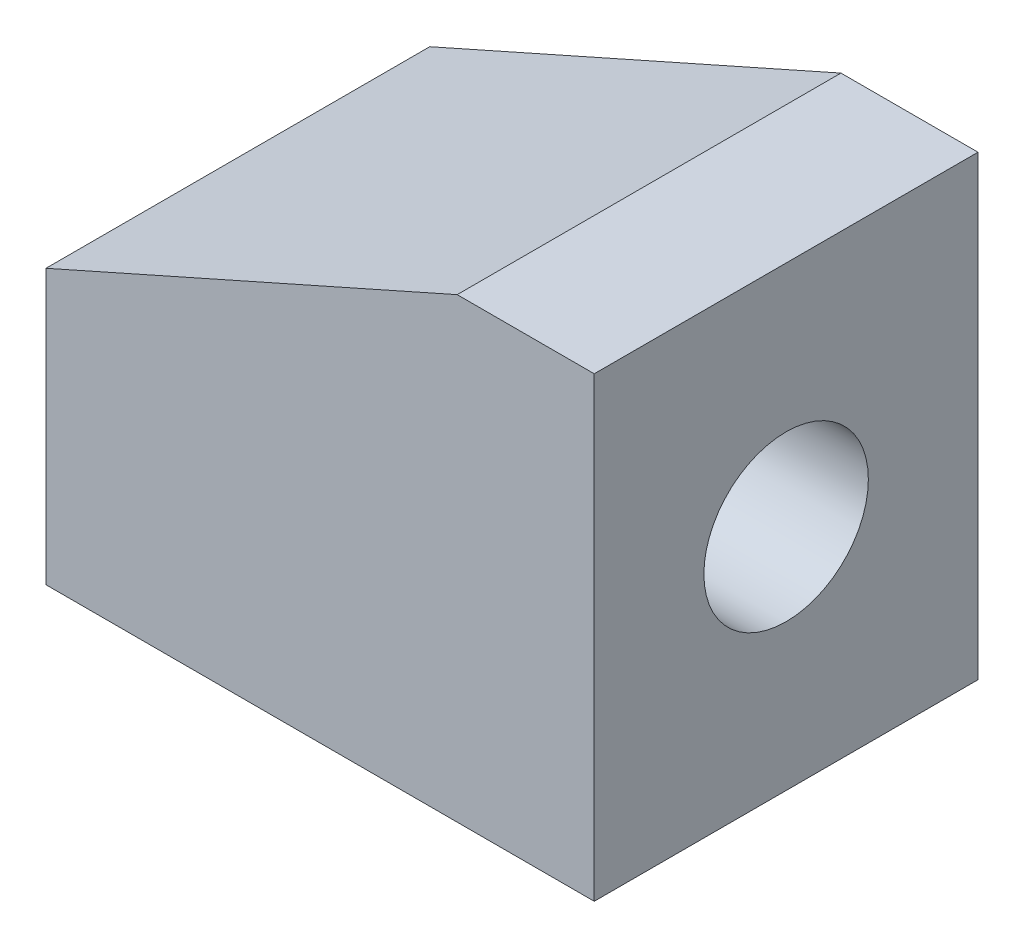
ISO-10303-21;
HEADER;
FILE_DESCRIPTION(('STEP AP214'),'2;1');
FILE_NAME('part.step','',(''),(''),'','','');
FILE_SCHEMA(('AUTOMOTIVE_DESIGN { 1 0 10303 214 1 1 1 1 }'));
ENDSEC;
DATA;
#1=APPLICATION_CONTEXT('core data for automotive mechanical design processes');
#2=APPLICATION_PROTOCOL_DEFINITION('international standard','automotive_design',2000,#1);
#3=PRODUCT_CONTEXT('',#1,'mechanical');
#4=PRODUCT('Part','Part','',(#3));
#5=PRODUCT_RELATED_PRODUCT_CATEGORY('part','',(#4));
#6=PRODUCT_DEFINITION_FORMATION('','',#4);
#7=PRODUCT_DEFINITION_CONTEXT('part definition',#1,'design');
#8=PRODUCT_DEFINITION('design','',#6,#7);
#9=PRODUCT_DEFINITION_SHAPE('','',#8);
#10=(LENGTH_UNIT() NAMED_UNIT(*) SI_UNIT(.MILLI.,.METRE.));
#11=(NAMED_UNIT(*) PLANE_ANGLE_UNIT() SI_UNIT($,.RADIAN.));
#12=(NAMED_UNIT(*) SI_UNIT($,.STERADIAN.) SOLID_ANGLE_UNIT());
#13=UNCERTAINTY_MEASURE_WITH_UNIT(LENGTH_MEASURE(1.E-05),#10,'distance_accuracy_value','');
#14=(GEOMETRIC_REPRESENTATION_CONTEXT(3) GLOBAL_UNCERTAINTY_ASSIGNED_CONTEXT((#13)) GLOBAL_UNIT_ASSIGNED_CONTEXT((#10,
#11,#12)) REPRESENTATION_CONTEXT('',''));
#15=CARTESIAN_POINT('',(0.,0.,0.));
#16=DIRECTION('',(0.,0.,1.));
#17=DIRECTION('',(1.,0.,0.));
#18=AXIS2_PLACEMENT_3D('',#15,#16,#17);
#19=CARTESIAN_POINT('',(0.,50.,21.));
#20=DIRECTION('',(-1.,0.,0.));
#21=DIRECTION('',(0.,-1.,0.));
#22=AXIS2_PLACEMENT_3D('',#19,#20,#21);
#23=PLANE('',#22);
#24=CARTESIAN_POINT('',(0.,25.,0.));
#25=DIRECTION('',(-1.,0.,0.));
#26=DIRECTION('',(0.,-1.,0.));
#27=AXIS2_PLACEMENT_3D('',#24,#25,#26);
#28=CIRCLE('',#27,9.);
#29=CARTESIAN_POINT('',(0.,16.,0.));
#30=VERTEX_POINT('',#29);
#31=EDGE_CURVE('E38',#30,#30,#28,.T.);
#32=ORIENTED_EDGE('',*,*,#31,.T.);
#33=EDGE_LOOP('',(#32));
#34=FACE_BOUND('',#33,.T.);
#35=DIRECTION('',(0.,1.,0.));
#36=VECTOR('',#35,1.);
#37=CARTESIAN_POINT('',(0.,50.,-21.));
#38=LINE('',#37,#36);
#39=CARTESIAN_POINT('',(0.,0.,-21.));
#40=VERTEX_POINT('',#39);
#41=CARTESIAN_POINT('',(0.,50.,-21.));
#42=VERTEX_POINT('',#41);
#43=EDGE_CURVE('E110',#40,#42,#38,.T.);
#44=ORIENTED_EDGE('',*,*,#43,.T.);
#45=DIRECTION('',(0.,0.,-1.));
#46=VECTOR('',#45,1.);
#47=CARTESIAN_POINT('',(0.,50.,21.));
#48=LINE('',#47,#46);
#49=CARTESIAN_POINT('',(0.,50.,21.));
#50=VERTEX_POINT('',#49);
#51=EDGE_CURVE('E11',#50,#42,#48,.T.);
#52=ORIENTED_EDGE('',*,*,#51,.F.);
#53=DIRECTION('',(0.,1.,0.));
#54=VECTOR('',#53,1.);
#55=CARTESIAN_POINT('',(0.,50.,21.));
#56=LINE('',#55,#54);
#57=CARTESIAN_POINT('',(0.,0.,21.));
#58=VERTEX_POINT('',#57);
#59=EDGE_CURVE('E118',#58,#50,#56,.T.);
#60=ORIENTED_EDGE('',*,*,#59,.F.);
#61=DIRECTION('',(0.,0.,-1.));
#62=VECTOR('',#61,1.);
#63=CARTESIAN_POINT('',(0.,0.,21.));
#64=LINE('',#63,#62);
#65=EDGE_CURVE('E106',#58,#40,#64,.T.);
#66=ORIENTED_EDGE('',*,*,#65,.T.);
#67=EDGE_LOOP('',(#44,#52,#60,#66));
#68=FACE_BOUND('',#67,.T.);
#69=ADVANCED_FACE('F35',(#34,#68),#23,.F.);
#70=CARTESIAN_POINT('',(-15.,50.,21.));
#71=DIRECTION('',(0.,-1.,0.));
#72=DIRECTION('',(0.,0.,-1.));
#73=AXIS2_PLACEMENT_3D('',#70,#71,#72);
#74=PLANE('',#73);
#75=DIRECTION('',(-1.,0.,0.));
#76=VECTOR('',#75,1.);
#77=CARTESIAN_POINT('',(-15.,50.,-21.));
#78=LINE('',#77,#76);
#79=CARTESIAN_POINT('',(-15.,50.,-21.));
#80=VERTEX_POINT('',#79);
#81=EDGE_CURVE('E113',#42,#80,#78,.T.);
#82=ORIENTED_EDGE('',*,*,#81,.T.);
#83=DIRECTION('',(0.,0.,-1.));
#84=VECTOR('',#83,1.);
#85=CARTESIAN_POINT('',(-15.,50.,21.));
#86=LINE('',#85,#84);
#87=CARTESIAN_POINT('',(-15.,50.,21.));
#88=VERTEX_POINT('',#87);
#89=EDGE_CURVE('E44',#88,#80,#86,.T.);
#90=ORIENTED_EDGE('',*,*,#89,.F.);
#91=DIRECTION('',(-1.,0.,0.));
#92=VECTOR('',#91,1.);
#93=CARTESIAN_POINT('',(-15.,50.,21.));
#94=LINE('',#93,#92);
#95=EDGE_CURVE('E86',#50,#88,#94,.T.);
#96=ORIENTED_EDGE('',*,*,#95,.F.);
#97=ORIENTED_EDGE('',*,*,#51,.T.);
#98=EDGE_LOOP('',(#82,#90,#96,#97));
#99=FACE_BOUND('',#98,.T.);
#100=ADVANCED_FACE('F138',(#99),#74,.F.);
#101=CARTESIAN_POINT('',(-60.,30.,21.));
#102=DIRECTION('',(0.406138466053448,-0.913811548620257,0.));
#103=DIRECTION('',(0.913811548620257,0.406138466053448,0.));
#104=AXIS2_PLACEMENT_3D('',#101,#102,#103);
#105=PLANE('',#104);
#106=DIRECTION('',(-0.913811548620257,-0.406138466053448,0.));
#107=VECTOR('',#106,1.);
#108=CARTESIAN_POINT('',(-60.,30.,-21.));
#109=LINE('',#108,#107);
#110=CARTESIAN_POINT('',(-60.,30.,-21.));
#111=VERTEX_POINT('',#110);
#112=EDGE_CURVE('E101',#80,#111,#109,.T.);
#113=ORIENTED_EDGE('',*,*,#112,.T.);
#114=DIRECTION('',(0.,0.,-1.));
#115=VECTOR('',#114,1.);
#116=CARTESIAN_POINT('',(-60.,30.,21.));
#117=LINE('',#116,#115);
#118=CARTESIAN_POINT('',(-60.,30.,21.));
#119=VERTEX_POINT('',#118);
#120=EDGE_CURVE('E98',#119,#111,#117,.T.);
#121=ORIENTED_EDGE('',*,*,#120,.F.);
#122=DIRECTION('',(-0.913811548620257,-0.406138466053448,0.));
#123=VECTOR('',#122,1.);
#124=CARTESIAN_POINT('',(-60.,30.,21.));
#125=LINE('',#124,#123);
#126=EDGE_CURVE('E90',#88,#119,#125,.T.);
#127=ORIENTED_EDGE('',*,*,#126,.F.);
#128=ORIENTED_EDGE('',*,*,#89,.T.);
#129=EDGE_LOOP('',(#113,#121,#127,#128));
#130=FACE_BOUND('',#129,.T.);
#131=ADVANCED_FACE('F99',(#130),#105,.F.);
#132=CARTESIAN_POINT('',(-60.,0.,21.));
#133=DIRECTION('',(1.,0.,0.));
#134=DIRECTION('',(0.,0.,-1.));
#135=AXIS2_PLACEMENT_3D('',#132,#133,#134);
#136=PLANE('',#135);
#137=DIRECTION('',(0.,-1.,0.));
#138=VECTOR('',#137,1.);
#139=CARTESIAN_POINT('',(-60.,0.,-21.));
#140=LINE('',#139,#138);
#141=CARTESIAN_POINT('',(-60.,0.,-21.));
#142=VERTEX_POINT('',#141);
#143=EDGE_CURVE('E72',#111,#142,#140,.T.);
#144=ORIENTED_EDGE('',*,*,#143,.T.);
#145=DIRECTION('',(0.,0.,-1.));
#146=VECTOR('',#145,1.);
#147=CARTESIAN_POINT('',(-60.,0.,21.));
#148=LINE('',#147,#146);
#149=CARTESIAN_POINT('',(-60.,0.,21.));
#150=VERTEX_POINT('',#149);
#151=EDGE_CURVE('E102',#150,#142,#148,.T.);
#152=ORIENTED_EDGE('',*,*,#151,.F.);
#153=DIRECTION('',(0.,-1.,0.));
#154=VECTOR('',#153,1.);
#155=CARTESIAN_POINT('',(-60.,0.,21.));
#156=LINE('',#155,#154);
#157=EDGE_CURVE('E94',#119,#150,#156,.T.);
#158=ORIENTED_EDGE('',*,*,#157,.F.);
#159=ORIENTED_EDGE('',*,*,#120,.T.);
#160=EDGE_LOOP('',(#144,#152,#158,#159));
#161=FACE_BOUND('',#160,.T.);
#162=ADVANCED_FACE('F104',(#161),#136,.F.);
#163=CARTESIAN_POINT('',(0.,0.,21.));
#164=DIRECTION('',(0.,1.,0.));
#165=DIRECTION('',(0.,0.,1.));
#166=AXIS2_PLACEMENT_3D('',#163,#164,#165);
#167=PLANE('',#166);
#168=DIRECTION('',(1.,0.,0.));
#169=VECTOR('',#168,1.);
#170=CARTESIAN_POINT('',(0.,0.,-21.));
#171=LINE('',#170,#169);
#172=EDGE_CURVE('E78',#142,#40,#171,.T.);
#173=ORIENTED_EDGE('',*,*,#172,.T.);
#174=ORIENTED_EDGE('',*,*,#65,.F.);
#175=DIRECTION('',(1.,0.,0.));
#176=VECTOR('',#175,1.);
#177=CARTESIAN_POINT('',(0.,0.,21.));
#178=LINE('',#177,#176);
#179=EDGE_CURVE('E52',#150,#58,#178,.T.);
#180=ORIENTED_EDGE('',*,*,#179,.F.);
#181=ORIENTED_EDGE('',*,*,#151,.T.);
#182=EDGE_LOOP('',(#173,#174,#180,#181));
#183=FACE_BOUND('',#182,.T.);
#184=ADVANCED_FACE('F127',(#183),#167,.F.);
#185=CARTESIAN_POINT('',(0.,0.,21.));
#186=DIRECTION('',(0.,0.,-1.));
#187=DIRECTION('',(-1.,0.,0.));
#188=AXIS2_PLACEMENT_3D('',#185,#186,#187);
#189=PLANE('',#188);
#190=ORIENTED_EDGE('',*,*,#59,.T.);
#191=ORIENTED_EDGE('',*,*,#95,.T.);
#192=ORIENTED_EDGE('',*,*,#126,.T.);
#193=ORIENTED_EDGE('',*,*,#157,.T.);
#194=ORIENTED_EDGE('',*,*,#179,.T.);
#195=EDGE_LOOP('',(#190,#191,#192,#193,#194));
#196=FACE_BOUND('',#195,.T.);
#197=ADVANCED_FACE('F92',(#196),#189,.F.);
#198=CARTESIAN_POINT('',(0.,0.,-21.));
#199=DIRECTION('',(0.,0.,-1.));
#200=DIRECTION('',(-1.,0.,0.));
#201=AXIS2_PLACEMENT_3D('',#198,#199,#200);
#202=PLANE('',#201);
#203=ORIENTED_EDGE('',*,*,#43,.F.);
#204=ORIENTED_EDGE('',*,*,#172,.F.);
#205=ORIENTED_EDGE('',*,*,#143,.F.);
#206=ORIENTED_EDGE('',*,*,#112,.F.);
#207=ORIENTED_EDGE('',*,*,#81,.F.);
#208=EDGE_LOOP('',(#203,#204,#205,#206,#207));
#209=FACE_BOUND('',#208,.T.);
#210=ADVANCED_FACE('F123',(#209),#202,.T.);
#211=CARTESIAN_POINT('',(-20.,25.,0.));
#212=DIRECTION('',(1.,0.,0.));
#213=DIRECTION('',(0.,1.,0.));
#214=AXIS2_PLACEMENT_3D('',#211,#212,#213);
#215=CYLINDRICAL_SURFACE('',#214,9.);
#216=CARTESIAN_POINT('',(-20.,25.,0.));
#217=DIRECTION('',(1.,0.,0.));
#218=DIRECTION('',(0.,1.,0.));
#219=AXIS2_PLACEMENT_3D('',#216,#217,#218);
#220=CIRCLE('',#219,9.);
#221=CARTESIAN_POINT('',(-20.,34.,0.));
#222=VERTEX_POINT('',#221);
#223=EDGE_CURVE('E146',#222,#222,#220,.T.);
#224=ORIENTED_EDGE('',*,*,#223,.F.);
#225=EDGE_LOOP('',(#224));
#226=FACE_BOUND('',#225,.T.);
#227=ORIENTED_EDGE('',*,*,#31,.F.);
#228=EDGE_LOOP('',(#227));
#229=FACE_BOUND('',#228,.T.);
#230=ADVANCED_FACE('F154',(#226,#229),#215,.F.);
#231=CARTESIAN_POINT('',(-20.,25.,0.));
#232=DIRECTION('',(1.,0.,0.));
#233=DIRECTION('',(0.,1.,0.));
#234=AXIS2_PLACEMENT_3D('',#231,#232,#233);
#235=PLANE('',#234);
#236=ORIENTED_EDGE('',*,*,#223,.T.);
#237=EDGE_LOOP('',(#236));
#238=FACE_BOUND('',#237,.T.);
#239=ADVANCED_FACE('F152',(#238),#235,.T.);
#240=CLOSED_SHELL('',(#69,#100,#131,#162,#184,#197,#210,#230,#239));
#241=MANIFOLD_SOLID_BREP('B2',#240);
#242=ADVANCED_BREP_SHAPE_REPRESENTATION('',(#18,#241),#14);
#243=SHAPE_DEFINITION_REPRESENTATION(#9,#242);
ENDSEC;
END-ISO-10303-21;
